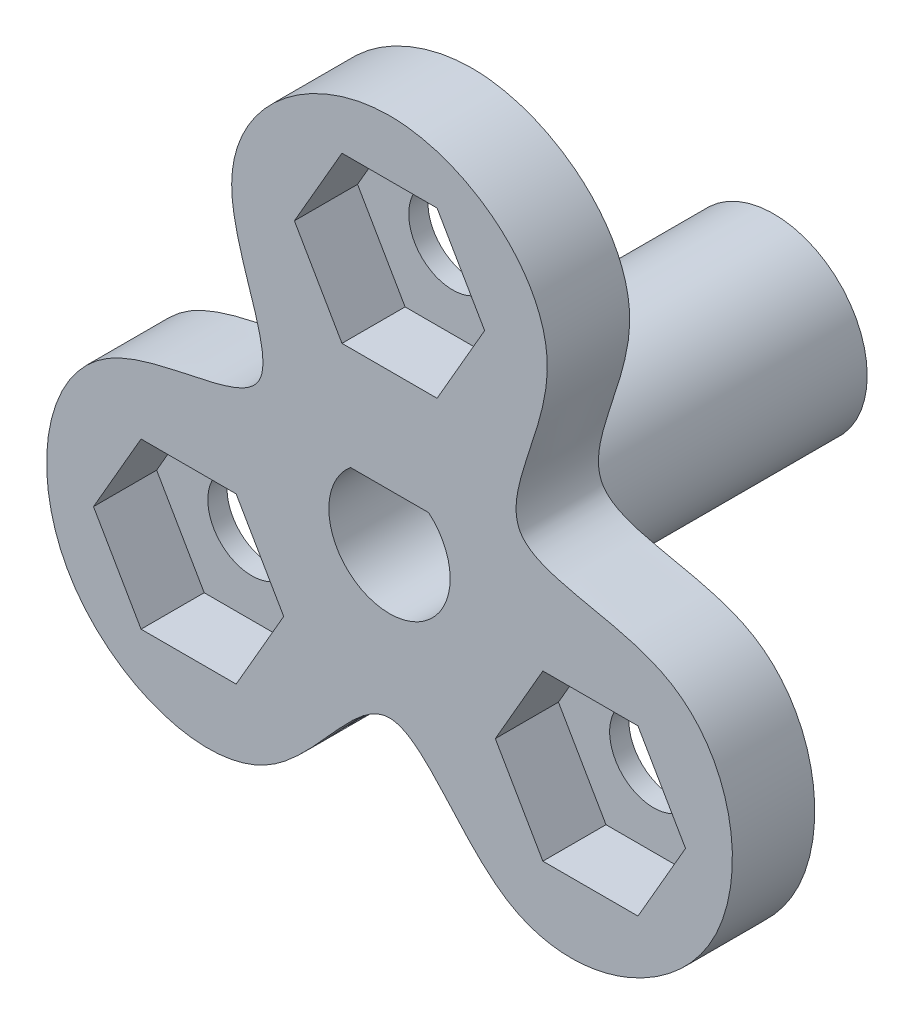
ISO-10303-21;
HEADER;
FILE_DESCRIPTION(('STEP AP214'),'2;1');
FILE_NAME('part.step','',(''),(''),'','','');
FILE_SCHEMA(('AUTOMOTIVE_DESIGN { 1 0 10303 214 1 1 1 1 }'));
ENDSEC;
DATA;
#1=APPLICATION_CONTEXT('core data for automotive mechanical design processes');
#2=APPLICATION_PROTOCOL_DEFINITION('international standard','automotive_design',2000,#1);
#3=PRODUCT_CONTEXT('',#1,'mechanical');
#4=PRODUCT('Part','Part','',(#3));
#5=PRODUCT_RELATED_PRODUCT_CATEGORY('part','',(#4));
#6=PRODUCT_DEFINITION_FORMATION('','',#4);
#7=PRODUCT_DEFINITION_CONTEXT('part definition',#1,'design');
#8=PRODUCT_DEFINITION('design','',#6,#7);
#9=PRODUCT_DEFINITION_SHAPE('','',#8);
#10=(LENGTH_UNIT() NAMED_UNIT(*) SI_UNIT(.MILLI.,.METRE.));
#11=(NAMED_UNIT(*) PLANE_ANGLE_UNIT() SI_UNIT($,.RADIAN.));
#12=(NAMED_UNIT(*) SI_UNIT($,.STERADIAN.) SOLID_ANGLE_UNIT());
#13=UNCERTAINTY_MEASURE_WITH_UNIT(LENGTH_MEASURE(1.E-05),#10,'distance_accuracy_value','');
#14=(GEOMETRIC_REPRESENTATION_CONTEXT(3) GLOBAL_UNCERTAINTY_ASSIGNED_CONTEXT((#13)) GLOBAL_UNIT_ASSIGNED_CONTEXT((#10,
#11,#12)) REPRESENTATION_CONTEXT('',''));
#15=CARTESIAN_POINT('',(0.,0.,0.));
#16=DIRECTION('',(0.,0.,1.));
#17=DIRECTION('',(1.,0.,0.));
#18=AXIS2_PLACEMENT_3D('',#15,#16,#17);
#19=CARTESIAN_POINT('',(-7.3179146619785,-4.225,0.7));
#20=DIRECTION('',(0.,0.,-1.));
#21=DIRECTION('',(-1.,0.,0.));
#22=AXIS2_PLACEMENT_3D('',#19,#20,#21);
#23=CYLINDRICAL_SURFACE('',#22,1.6);
#24=CARTESIAN_POINT('',(-7.3179146619785,-4.225,0.7));
#25=DIRECTION('',(0.,0.,1.));
#26=DIRECTION('',(1.,0.,0.));
#27=AXIS2_PLACEMENT_3D('',#24,#25,#26);
#28=CIRCLE('',#27,1.6);
#29=CARTESIAN_POINT('',(-5.71791466197851,-4.225,0.7));
#30=VERTEX_POINT('',#29);
#31=EDGE_CURVE('E384',#30,#30,#28,.T.);
#32=ORIENTED_EDGE('',*,*,#31,.T.);
#33=EDGE_LOOP('',(#32));
#34=FACE_BOUND('',#33,.T.);
#35=CARTESIAN_POINT('',(-7.3179146619785,-4.225,0.));
#36=DIRECTION('',(0.,0.,1.));
#37=DIRECTION('',(1.,0.,0.));
#38=AXIS2_PLACEMENT_3D('',#35,#36,#37);
#39=CIRCLE('',#38,1.6);
#40=CARTESIAN_POINT('',(-5.71791466197851,-4.225,0.));
#41=VERTEX_POINT('',#40);
#42=EDGE_CURVE('E42',#41,#41,#39,.T.);
#43=ORIENTED_EDGE('',*,*,#42,.F.);
#44=EDGE_LOOP('',(#43));
#45=FACE_BOUND('',#44,.T.);
#46=ADVANCED_FACE('F39',(#34,#45),#23,.F.);
#47=CARTESIAN_POINT('',(0.,0.,0.7));
#48=DIRECTION('',(0.,0.,1.));
#49=DIRECTION('',(1.,0.,0.));
#50=AXIS2_PLACEMENT_3D('',#47,#48,#49);
#51=PLANE('',#50);
#52=ORIENTED_EDGE('',*,*,#31,.F.);
#53=EDGE_LOOP('',(#52));
#54=FACE_BOUND('',#53,.T.);
#55=DIRECTION('',(0.500000000000001,-0.866025403784438,0.));
#56=VECTOR('',#55,1.);
#57=CARTESIAN_POINT('',(-9.91599087333181,-5.72500000000001,0.7));
#58=LINE('',#57,#56);
#59=CARTESIAN_POINT('',(-10.7820162771163,-4.22500000000001,0.7));
#60=VERTEX_POINT('',#59);
#61=CARTESIAN_POINT('',(-9.04996546954738,-7.225,0.7));
#62=VERTEX_POINT('',#61);
#63=EDGE_CURVE('E387',#60,#62,#58,.T.);
#64=ORIENTED_EDGE('',*,*,#63,.T.);
#65=DIRECTION('',(1.,0.,0.));
#66=VECTOR('',#65,1.);
#67=CARTESIAN_POINT('',(0.,-7.225,0.7));
#68=LINE('',#67,#66);
#69=CARTESIAN_POINT('',(-5.58586385440963,-7.225,0.7));
#70=VERTEX_POINT('',#69);
#71=EDGE_CURVE('E62',#62,#70,#68,.T.);
#72=ORIENTED_EDGE('',*,*,#71,.T.);
#73=DIRECTION('',(0.5,0.866025403784439,0.));
#74=VECTOR('',#73,1.);
#75=CARTESIAN_POINT('',(-1.06088111963594,0.6125,0.7));
#76=LINE('',#75,#74);
#77=CARTESIAN_POINT('',(-3.85381304684075,-4.225,0.7));
#78=VERTEX_POINT('',#77);
#79=EDGE_CURVE('E407',#70,#78,#76,.T.);
#80=ORIENTED_EDGE('',*,*,#79,.T.);
#81=DIRECTION('',(-0.500000000000001,0.866025403784438,0.));
#82=VECTOR('',#81,1.);
#83=CARTESIAN_POINT('',(-4.71983845062519,-2.725,0.7));
#84=LINE('',#83,#82);
#85=CARTESIAN_POINT('',(-5.58586385440963,-1.225,0.7));
#86=VERTEX_POINT('',#85);
#87=EDGE_CURVE('E410',#78,#86,#84,.T.);
#88=ORIENTED_EDGE('',*,*,#87,.T.);
#89=DIRECTION('',(-1.,0.,0.));
#90=VECTOR('',#89,1.);
#91=CARTESIAN_POINT('',(0.,-1.225,0.7));
#92=LINE('',#91,#90);
#93=CARTESIAN_POINT('',(-9.04996546954738,-1.22500000000001,0.7));
#94=VERTEX_POINT('',#93);
#95=EDGE_CURVE('E47',#86,#94,#92,.T.);
#96=ORIENTED_EDGE('',*,*,#95,.T.);
#97=DIRECTION('',(-0.499999999999999,-0.866025403784439,0.));
#98=VECTOR('',#97,1.);
#99=CARTESIAN_POINT('',(-6.25703354234258,3.61249999999999,0.7));
#100=LINE('',#99,#98);
#101=EDGE_CURVE('E11',#94,#60,#100,.T.);
#102=ORIENTED_EDGE('',*,*,#101,.T.);
#103=EDGE_LOOP('',(#64,#72,#80,#88,#96,#102));
#104=FACE_BOUND('',#103,.T.);
#105=ADVANCED_FACE('F368',(#54,#104),#51,.T.);
#106=CARTESIAN_POINT('',(0.,0.,0.));
#107=DIRECTION('',(0.,0.,1.));
#108=DIRECTION('',(1.,0.,0.));
#109=AXIS2_PLACEMENT_3D('',#106,#107,#108);
#110=PLANE('',#109);
#111=ORIENTED_EDGE('',*,*,#42,.T.);
#112=EDGE_LOOP('',(#111));
#113=FACE_BOUND('',#112,.T.);
#114=CARTESIAN_POINT('',(0.,8.45,0.));
#115=DIRECTION('',(0.,0.,1.));
#116=DIRECTION('',(1.,0.,0.));
#117=AXIS2_PLACEMENT_3D('',#114,#115,#116);
#118=CIRCLE('',#117,1.6);
#119=CARTESIAN_POINT('',(1.6,8.45,0.));
#120=VERTEX_POINT('',#119);
#121=EDGE_CURVE('E399',#120,#120,#118,.T.);
#122=ORIENTED_EDGE('',*,*,#121,.T.);
#123=EDGE_LOOP('',(#122));
#124=FACE_BOUND('',#123,.T.);
#125=CARTESIAN_POINT('',(7.31791466197851,-4.225,0.));
#126=DIRECTION('',(0.,0.,1.));
#127=DIRECTION('',(1.,0.,0.));
#128=AXIS2_PLACEMENT_3D('',#125,#126,#127);
#129=CIRCLE('',#128,1.6);
#130=CARTESIAN_POINT('',(8.91791466197851,-4.225,0.));
#131=VERTEX_POINT('',#130);
#132=EDGE_CURVE('E431',#131,#131,#129,.T.);
#133=ORIENTED_EDGE('',*,*,#132,.T.);
#134=EDGE_LOOP('',(#133));
#135=FACE_BOUND('',#134,.T.);
#136=CARTESIAN_POINT('',(0.,0.,0.));
#137=DIRECTION('',(0.,0.,1.));
#138=DIRECTION('',(1.,0.,0.));
#139=AXIS2_PLACEMENT_3D('',#136,#137,#138);
#140=CIRCLE('',#139,3.4);
#141=CARTESIAN_POINT('',(3.4,0.,0.));
#142=VERTEX_POINT('',#141);
#143=EDGE_CURVE('E203',#142,#142,#140,.T.);
#144=ORIENTED_EDGE('',*,*,#143,.T.);
#145=EDGE_LOOP('',(#144));
#146=FACE_BOUND('',#145,.T.);
#147=CARTESIAN_POINT('',(0.,13.5,0.));
#148=CARTESIAN_POINT('',(-2.87331985999361,13.5,0.));
#149=CARTESIAN_POINT('',(-7.91873378007043,9.56576436059761,0.));
#150=CARTESIAN_POINT('',(-2.47369152937391,1.42818647037611,0.));
#151=CARTESIAN_POINT('',(-12.2435618329286,2.07494243904816,0.));
#152=CARTESIAN_POINT('',(-13.6316844558638,-7.870256690101,0.));
#153=CARTESIAN_POINT('',(-4.32482805285811,-11.6407067996458,0.));
#154=CARTESIAN_POINT('',(0.,-2.85637294075223,0.));
#155=CARTESIAN_POINT('',(4.32482805285813,-11.6407067996458,0.));
#156=CARTESIAN_POINT('',(13.6316844558638,-7.870256690101,0.));
#157=CARTESIAN_POINT('',(12.2435618329286,2.07494243904817,0.));
#158=CARTESIAN_POINT('',(2.47369152937389,1.42818647037613,0.));
#159=CARTESIAN_POINT('',(7.91873378007044,9.56576436059761,0.));
#160=CARTESIAN_POINT('',(2.87331985999361,13.5,0.));
#161=CARTESIAN_POINT('',(0.,13.5,0.));
#162=B_SPLINE_CURVE_WITH_KNOTS('',3,(#147,#148,#149,#150,#151,#152,#153,#154,#155,#156,#157,
#158,#159,#160,#161),.UNSPECIFIED.,.T.,.F.,(4,1,1,1,1,1,1,1,1,1,1,1,4),(0.,0.0949152340953971,
0.166666666666667,0.238418099237936,0.333333333333333,0.428248567428731,0.5,0.57175143257127,
0.666666666666667,0.761581900762064,0.833333333333333,0.905084765904603,1.),.UNSPECIFIED.);
#163=CARTESIAN_POINT('',(0.,13.5,0.));
#164=VERTEX_POINT('',#163);
#165=EDGE_CURVE('E207',#164,#164,#162,.T.);
#166=ORIENTED_EDGE('',*,*,#165,.F.);
#167=EDGE_LOOP('',(#166));
#168=FACE_BOUND('',#167,.T.);
#169=ADVANCED_FACE('F302',(#113,#124,#135,#146,#168),#110,.F.);
#170=CARTESIAN_POINT('',(-9.91599087333181,-5.72500000000001,3.));
#171=DIRECTION('',(0.866025403784438,0.500000000000001,0.));
#172=DIRECTION('',(-0.500000000000001,0.866025403784438,0.));
#173=AXIS2_PLACEMENT_3D('',#170,#171,#172);
#174=PLANE('',#173);
#175=ORIENTED_EDGE('',*,*,#63,.F.);
#176=DIRECTION('',(0.,0.,-1.));
#177=VECTOR('',#176,1.);
#178=CARTESIAN_POINT('',(-10.7820162771163,-4.22500000000001,3.));
#179=LINE('',#178,#177);
#180=CARTESIAN_POINT('',(-10.7820162771163,-4.22500000000001,3.));
#181=VERTEX_POINT('',#180);
#182=EDGE_CURVE('E54',#181,#60,#179,.T.);
#183=ORIENTED_EDGE('',*,*,#182,.F.);
#184=DIRECTION('',(0.500000000000001,-0.866025403784438,0.));
#185=VECTOR('',#184,1.);
#186=CARTESIAN_POINT('',(-9.91599087333181,-5.72500000000001,3.));
#187=LINE('',#186,#185);
#188=CARTESIAN_POINT('',(-9.04996546954738,-7.225,3.));
#189=VERTEX_POINT('',#188);
#190=EDGE_CURVE('E247',#181,#189,#187,.T.);
#191=ORIENTED_EDGE('',*,*,#190,.T.);
#192=DIRECTION('',(0.,0.,-1.));
#193=VECTOR('',#192,1.);
#194=CARTESIAN_POINT('',(-9.04996546954738,-7.225,3.));
#195=LINE('',#194,#193);
#196=EDGE_CURVE('E429',#189,#62,#195,.T.);
#197=ORIENTED_EDGE('',*,*,#196,.T.);
#198=EDGE_LOOP('',(#175,#183,#191,#197));
#199=FACE_BOUND('',#198,.T.);
#200=ADVANCED_FACE('F299',(#199),#174,.T.);
#201=CARTESIAN_POINT('',(0.,-7.225,3.));
#202=DIRECTION('',(0.,1.,0.));
#203=DIRECTION('',(-1.,0.,0.));
#204=AXIS2_PLACEMENT_3D('',#201,#202,#203);
#205=PLANE('',#204);
#206=ORIENTED_EDGE('',*,*,#71,.F.);
#207=ORIENTED_EDGE('',*,*,#196,.F.);
#208=DIRECTION('',(1.,0.,0.));
#209=VECTOR('',#208,1.);
#210=CARTESIAN_POINT('',(0.,-7.225,3.));
#211=LINE('',#210,#209);
#212=CARTESIAN_POINT('',(-5.58586385440963,-7.225,3.));
#213=VERTEX_POINT('',#212);
#214=EDGE_CURVE('E244',#189,#213,#211,.T.);
#215=ORIENTED_EDGE('',*,*,#214,.T.);
#216=DIRECTION('',(0.,0.,-1.));
#217=VECTOR('',#216,1.);
#218=CARTESIAN_POINT('',(-5.58586385440963,-7.225,3.));
#219=LINE('',#218,#217);
#220=EDGE_CURVE('E425',#213,#70,#219,.T.);
#221=ORIENTED_EDGE('',*,*,#220,.T.);
#222=EDGE_LOOP('',(#206,#207,#215,#221));
#223=FACE_BOUND('',#222,.T.);
#224=ADVANCED_FACE('F286',(#223),#205,.T.);
#225=CARTESIAN_POINT('',(-1.06088111963594,0.6125,3.));
#226=DIRECTION('',(-0.866025403784439,0.5,0.));
#227=DIRECTION('',(-0.5,-0.866025403784439,0.));
#228=AXIS2_PLACEMENT_3D('',#225,#226,#227);
#229=PLANE('',#228);
#230=ORIENTED_EDGE('',*,*,#79,.F.);
#231=ORIENTED_EDGE('',*,*,#220,.F.);
#232=DIRECTION('',(0.5,0.866025403784439,0.));
#233=VECTOR('',#232,1.);
#234=CARTESIAN_POINT('',(-1.06088111963594,0.6125,3.));
#235=LINE('',#234,#233);
#236=CARTESIAN_POINT('',(-3.85381304684075,-4.225,3.));
#237=VERTEX_POINT('',#236);
#238=EDGE_CURVE('E258',#213,#237,#235,.T.);
#239=ORIENTED_EDGE('',*,*,#238,.T.);
#240=DIRECTION('',(0.,0.,-1.));
#241=VECTOR('',#240,1.);
#242=CARTESIAN_POINT('',(-3.85381304684075,-4.225,3.));
#243=LINE('',#242,#241);
#244=EDGE_CURVE('E422',#237,#78,#243,.T.);
#245=ORIENTED_EDGE('',*,*,#244,.T.);
#246=EDGE_LOOP('',(#230,#231,#239,#245));
#247=FACE_BOUND('',#246,.T.);
#248=ADVANCED_FACE('F282',(#247),#229,.T.);
#249=CARTESIAN_POINT('',(-4.71983845062519,-2.725,3.));
#250=DIRECTION('',(-0.866025403784438,-0.500000000000001,0.));
#251=DIRECTION('',(0.500000000000001,-0.866025403784438,0.));
#252=AXIS2_PLACEMENT_3D('',#249,#250,#251);
#253=PLANE('',#252);
#254=ORIENTED_EDGE('',*,*,#87,.F.);
#255=ORIENTED_EDGE('',*,*,#244,.F.);
#256=DIRECTION('',(-0.500000000000001,0.866025403784438,0.));
#257=VECTOR('',#256,1.);
#258=CARTESIAN_POINT('',(-4.71983845062519,-2.725,3.));
#259=LINE('',#258,#257);
#260=CARTESIAN_POINT('',(-5.58586385440963,-1.225,3.));
#261=VERTEX_POINT('',#260);
#262=EDGE_CURVE('E255',#237,#261,#259,.T.);
#263=ORIENTED_EDGE('',*,*,#262,.T.);
#264=DIRECTION('',(0.,0.,-1.));
#265=VECTOR('',#264,1.);
#266=CARTESIAN_POINT('',(-5.58586385440963,-1.225,3.));
#267=LINE('',#266,#265);
#268=EDGE_CURVE('E417',#261,#86,#267,.T.);
#269=ORIENTED_EDGE('',*,*,#268,.T.);
#270=EDGE_LOOP('',(#254,#255,#263,#269));
#271=FACE_BOUND('',#270,.T.);
#272=ADVANCED_FACE('F285',(#271),#253,.T.);
#273=CARTESIAN_POINT('',(0.,-1.225,3.));
#274=DIRECTION('',(0.,-1.,0.));
#275=DIRECTION('',(1.,0.,0.));
#276=AXIS2_PLACEMENT_3D('',#273,#274,#275);
#277=PLANE('',#276);
#278=ORIENTED_EDGE('',*,*,#95,.F.);
#279=ORIENTED_EDGE('',*,*,#268,.F.);
#280=DIRECTION('',(-1.,0.,0.));
#281=VECTOR('',#280,1.);
#282=CARTESIAN_POINT('',(0.,-1.225,3.));
#283=LINE('',#282,#281);
#284=CARTESIAN_POINT('',(-9.04996546954738,-1.22500000000001,3.));
#285=VERTEX_POINT('',#284);
#286=EDGE_CURVE('E252',#261,#285,#283,.T.);
#287=ORIENTED_EDGE('',*,*,#286,.T.);
#288=DIRECTION('',(0.,0.,-1.));
#289=VECTOR('',#288,1.);
#290=CARTESIAN_POINT('',(-9.04996546954738,-1.22500000000001,3.));
#291=LINE('',#290,#289);
#292=EDGE_CURVE('E419',#285,#94,#291,.T.);
#293=ORIENTED_EDGE('',*,*,#292,.T.);
#294=EDGE_LOOP('',(#278,#279,#287,#293));
#295=FACE_BOUND('',#294,.T.);
#296=ADVANCED_FACE('F290',(#295),#277,.T.);
#297=CARTESIAN_POINT('',(-6.25703354234258,3.61249999999999,3.));
#298=DIRECTION('',(0.866025403784439,-0.499999999999999,0.));
#299=DIRECTION('',(0.499999999999999,0.866025403784439,0.));
#300=AXIS2_PLACEMENT_3D('',#297,#298,#299);
#301=PLANE('',#300);
#302=ORIENTED_EDGE('',*,*,#101,.F.);
#303=ORIENTED_EDGE('',*,*,#292,.F.);
#304=DIRECTION('',(-0.499999999999999,-0.866025403784439,0.));
#305=VECTOR('',#304,1.);
#306=CARTESIAN_POINT('',(-6.25703354234258,3.61249999999999,3.));
#307=LINE('',#306,#305);
#308=EDGE_CURVE('E250',#285,#181,#307,.T.);
#309=ORIENTED_EDGE('',*,*,#308,.T.);
#310=ORIENTED_EDGE('',*,*,#182,.T.);
#311=EDGE_LOOP('',(#302,#303,#309,#310));
#312=FACE_BOUND('',#311,.T.);
#313=ADVANCED_FACE('F294',(#312),#301,.T.);
#314=CARTESIAN_POINT('',(0.,8.45,0.7));
#315=DIRECTION('',(0.,0.,-1.));
#316=DIRECTION('',(-1.,0.,0.));
#317=AXIS2_PLACEMENT_3D('',#314,#315,#316);
#318=CYLINDRICAL_SURFACE('',#317,1.6);
#319=CARTESIAN_POINT('',(0.,8.45,0.7));
#320=DIRECTION('',(0.,0.,1.));
#321=DIRECTION('',(1.,0.,0.));
#322=AXIS2_PLACEMENT_3D('',#319,#320,#321);
#323=CIRCLE('',#322,1.6);
#324=CARTESIAN_POINT('',(1.6,8.45,0.7));
#325=VERTEX_POINT('',#324);
#326=EDGE_CURVE('E401',#325,#325,#323,.T.);
#327=ORIENTED_EDGE('',*,*,#326,.T.);
#328=EDGE_LOOP('',(#327));
#329=FACE_BOUND('',#328,.T.);
#330=ORIENTED_EDGE('',*,*,#121,.F.);
#331=EDGE_LOOP('',(#330));
#332=FACE_BOUND('',#331,.T.);
#333=ADVANCED_FACE('F298',(#329,#332),#318,.F.);
#334=CARTESIAN_POINT('',(0.,0.,0.7));
#335=DIRECTION('',(0.,0.,1.));
#336=DIRECTION('',(1.,0.,0.));
#337=AXIS2_PLACEMENT_3D('',#334,#335,#336);
#338=PLANE('',#337);
#339=ORIENTED_EDGE('',*,*,#326,.F.);
#340=EDGE_LOOP('',(#339));
#341=FACE_BOUND('',#340,.T.);
#342=DIRECTION('',(-1.,0.,0.));
#343=VECTOR('',#342,1.);
#344=CARTESIAN_POINT('',(0.,11.45,0.7));
#345=LINE('',#344,#343);
#346=CARTESIAN_POINT('',(1.73205080756887,11.45,0.7));
#347=VERTEX_POINT('',#346);
#348=CARTESIAN_POINT('',(-1.73205080756888,11.45,0.7));
#349=VERTEX_POINT('',#348);
#350=EDGE_CURVE('E489',#347,#349,#345,.T.);
#351=ORIENTED_EDGE('',*,*,#350,.T.);
#352=DIRECTION('',(-0.5,-0.866025403784439,0.));
#353=VECTOR('',#352,1.);
#354=CARTESIAN_POINT('',(-6.25703354234257,3.61249999999999,0.7));
#355=LINE('',#354,#353);
#356=CARTESIAN_POINT('',(-3.46410161513775,8.45,0.7));
#357=VERTEX_POINT('',#356);
#358=EDGE_CURVE('E491',#349,#357,#355,.T.);
#359=ORIENTED_EDGE('',*,*,#358,.T.);
#360=DIRECTION('',(0.5,-0.866025403784439,0.));
#361=VECTOR('',#360,1.);
#362=CARTESIAN_POINT('',(1.06088111963594,0.612500000000001,0.7));
#363=LINE('',#362,#361);
#364=CARTESIAN_POINT('',(-1.73205080756887,5.45,0.7));
#365=VERTEX_POINT('',#364);
#366=EDGE_CURVE('E494',#357,#365,#363,.T.);
#367=ORIENTED_EDGE('',*,*,#366,.T.);
#368=DIRECTION('',(1.,0.,0.));
#369=VECTOR('',#368,1.);
#370=CARTESIAN_POINT('',(0.,5.45,0.7));
#371=LINE('',#370,#369);
#372=CARTESIAN_POINT('',(1.73205080756888,5.45,0.7));
#373=VERTEX_POINT('',#372);
#374=EDGE_CURVE('E395',#365,#373,#371,.T.);
#375=ORIENTED_EDGE('',*,*,#374,.T.);
#376=DIRECTION('',(0.499999999999999,0.866025403784439,0.));
#377=VECTOR('',#376,1.);
#378=CARTESIAN_POINT('',(-1.06088111963593,0.612499999999997,0.7));
#379=LINE('',#378,#377);
#380=CARTESIAN_POINT('',(3.46410161513775,8.45,0.7));
#381=VERTEX_POINT('',#380);
#382=EDGE_CURVE('E390',#373,#381,#379,.T.);
#383=ORIENTED_EDGE('',*,*,#382,.T.);
#384=DIRECTION('',(-0.5,0.866025403784438,0.));
#385=VECTOR('',#384,1.);
#386=CARTESIAN_POINT('',(6.25703354234257,3.6125,0.7));
#387=LINE('',#386,#385);
#388=EDGE_CURVE('E386',#381,#347,#387,.T.);
#389=ORIENTED_EDGE('',*,*,#388,.T.);
#390=EDGE_LOOP('',(#351,#359,#367,#375,#383,#389));
#391=FACE_BOUND('',#390,.T.);
#392=ADVANCED_FACE('F351',(#341,#391),#338,.T.);
#393=CARTESIAN_POINT('',(0.,11.45,3.));
#394=DIRECTION('',(0.,-1.,0.));
#395=DIRECTION('',(1.,0.,0.));
#396=AXIS2_PLACEMENT_3D('',#393,#394,#395);
#397=PLANE('',#396);
#398=ORIENTED_EDGE('',*,*,#350,.F.);
#399=DIRECTION('',(0.,0.,-1.));
#400=VECTOR('',#399,1.);
#401=CARTESIAN_POINT('',(1.73205080756887,11.45,3.));
#402=LINE('',#401,#400);
#403=CARTESIAN_POINT('',(1.73205080756887,11.45,3.));
#404=VERTEX_POINT('',#403);
#405=EDGE_CURVE('E461',#404,#347,#402,.T.);
#406=ORIENTED_EDGE('',*,*,#405,.F.);
#407=DIRECTION('',(-1.,0.,0.));
#408=VECTOR('',#407,1.);
#409=CARTESIAN_POINT('',(0.,11.45,3.));
#410=LINE('',#409,#408);
#411=CARTESIAN_POINT('',(-1.73205080756888,11.45,3.));
#412=VERTEX_POINT('',#411);
#413=EDGE_CURVE('E211',#404,#412,#410,.T.);
#414=ORIENTED_EDGE('',*,*,#413,.T.);
#415=DIRECTION('',(0.,0.,-1.));
#416=VECTOR('',#415,1.);
#417=CARTESIAN_POINT('',(-1.73205080756888,11.45,3.));
#418=LINE('',#417,#416);
#419=EDGE_CURVE('E436',#412,#349,#418,.T.);
#420=ORIENTED_EDGE('',*,*,#419,.T.);
#421=EDGE_LOOP('',(#398,#406,#414,#420));
#422=FACE_BOUND('',#421,.T.);
#423=ADVANCED_FACE('F348',(#422),#397,.T.);
#424=CARTESIAN_POINT('',(-6.25703354234257,3.61249999999999,3.));
#425=DIRECTION('',(0.866025403784439,-0.5,0.));
#426=DIRECTION('',(0.5,0.866025403784439,0.));
#427=AXIS2_PLACEMENT_3D('',#424,#425,#426);
#428=PLANE('',#427);
#429=ORIENTED_EDGE('',*,*,#358,.F.);
#430=ORIENTED_EDGE('',*,*,#419,.F.);
#431=DIRECTION('',(-0.5,-0.866025403784439,0.));
#432=VECTOR('',#431,1.);
#433=CARTESIAN_POINT('',(-6.25703354234257,3.61249999999999,3.));
#434=LINE('',#433,#432);
#435=CARTESIAN_POINT('',(-3.46410161513775,8.45,3.));
#436=VERTEX_POINT('',#435);
#437=EDGE_CURVE('E208',#412,#436,#434,.T.);
#438=ORIENTED_EDGE('',*,*,#437,.T.);
#439=DIRECTION('',(0.,0.,-1.));
#440=VECTOR('',#439,1.);
#441=CARTESIAN_POINT('',(-3.46410161513775,8.45,3.));
#442=LINE('',#441,#440);
#443=EDGE_CURVE('E267',#436,#357,#442,.T.);
#444=ORIENTED_EDGE('',*,*,#443,.T.);
#445=EDGE_LOOP('',(#429,#430,#438,#444));
#446=FACE_BOUND('',#445,.T.);
#447=ADVANCED_FACE('F334',(#446),#428,.T.);
#448=CARTESIAN_POINT('',(1.06088111963594,0.612500000000001,3.));
#449=DIRECTION('',(0.866025403784439,0.5,0.));
#450=DIRECTION('',(-0.5,0.866025403784439,0.));
#451=AXIS2_PLACEMENT_3D('',#448,#449,#450);
#452=PLANE('',#451);
#453=ORIENTED_EDGE('',*,*,#366,.F.);
#454=ORIENTED_EDGE('',*,*,#443,.F.);
#455=DIRECTION('',(0.5,-0.866025403784439,0.));
#456=VECTOR('',#455,1.);
#457=CARTESIAN_POINT('',(1.06088111963594,0.612500000000001,3.));
#458=LINE('',#457,#456);
#459=CARTESIAN_POINT('',(-1.73205080756887,5.45,3.));
#460=VERTEX_POINT('',#459);
#461=EDGE_CURVE('E223',#436,#460,#458,.T.);
#462=ORIENTED_EDGE('',*,*,#461,.T.);
#463=DIRECTION('',(0.,0.,-1.));
#464=VECTOR('',#463,1.);
#465=CARTESIAN_POINT('',(-1.73205080756887,5.45,3.));
#466=LINE('',#465,#464);
#467=EDGE_CURVE('E452',#460,#365,#466,.T.);
#468=ORIENTED_EDGE('',*,*,#467,.T.);
#469=EDGE_LOOP('',(#453,#454,#462,#468));
#470=FACE_BOUND('',#469,.T.);
#471=ADVANCED_FACE('F330',(#470),#452,.T.);
#472=CARTESIAN_POINT('',(0.,5.45,3.));
#473=DIRECTION('',(0.,1.,0.));
#474=DIRECTION('',(0.,0.,1.));
#475=AXIS2_PLACEMENT_3D('',#472,#473,#474);
#476=PLANE('',#475);
#477=ORIENTED_EDGE('',*,*,#374,.F.);
#478=ORIENTED_EDGE('',*,*,#467,.F.);
#479=DIRECTION('',(1.,0.,0.));
#480=VECTOR('',#479,1.);
#481=CARTESIAN_POINT('',(0.,5.45,3.));
#482=LINE('',#481,#480);
#483=CARTESIAN_POINT('',(1.73205080756888,5.45,3.));
#484=VERTEX_POINT('',#483);
#485=EDGE_CURVE('E220',#460,#484,#482,.T.);
#486=ORIENTED_EDGE('',*,*,#485,.T.);
#487=DIRECTION('',(0.,0.,-1.));
#488=VECTOR('',#487,1.);
#489=CARTESIAN_POINT('',(1.73205080756888,5.45,3.));
#490=LINE('',#489,#488);
#491=EDGE_CURVE('E455',#484,#373,#490,.T.);
#492=ORIENTED_EDGE('',*,*,#491,.T.);
#493=EDGE_LOOP('',(#477,#478,#486,#492));
#494=FACE_BOUND('',#493,.T.);
#495=ADVANCED_FACE('F333',(#494),#476,.T.);
#496=CARTESIAN_POINT('',(-1.06088111963593,0.612499999999997,3.));
#497=DIRECTION('',(-0.866025403784439,0.499999999999999,0.));
#498=DIRECTION('',(-0.499999999999999,-0.866025403784439,0.));
#499=AXIS2_PLACEMENT_3D('',#496,#497,#498);
#500=PLANE('',#499);
#501=ORIENTED_EDGE('',*,*,#382,.F.);
#502=ORIENTED_EDGE('',*,*,#491,.F.);
#503=DIRECTION('',(0.499999999999999,0.866025403784439,0.));
#504=VECTOR('',#503,1.);
#505=CARTESIAN_POINT('',(-1.06088111963593,0.612499999999997,3.));
#506=LINE('',#505,#504);
#507=CARTESIAN_POINT('',(3.46410161513775,8.45,3.));
#508=VERTEX_POINT('',#507);
#509=EDGE_CURVE('E217',#484,#508,#506,.T.);
#510=ORIENTED_EDGE('',*,*,#509,.T.);
#511=DIRECTION('',(0.,0.,-1.));
#512=VECTOR('',#511,1.);
#513=CARTESIAN_POINT('',(3.46410161513775,8.45,3.));
#514=LINE('',#513,#512);
#515=EDGE_CURVE('E458',#508,#381,#514,.T.);
#516=ORIENTED_EDGE('',*,*,#515,.T.);
#517=EDGE_LOOP('',(#501,#502,#510,#516));
#518=FACE_BOUND('',#517,.T.);
#519=ADVANCED_FACE('F338',(#518),#500,.T.);
#520=CARTESIAN_POINT('',(6.25703354234257,3.6125,3.));
#521=DIRECTION('',(-0.866025403784438,-0.5,0.));
#522=DIRECTION('',(0.5,-0.866025403784438,0.));
#523=AXIS2_PLACEMENT_3D('',#520,#521,#522);
#524=PLANE('',#523);
#525=ORIENTED_EDGE('',*,*,#388,.F.);
#526=ORIENTED_EDGE('',*,*,#515,.F.);
#527=DIRECTION('',(-0.5,0.866025403784438,0.));
#528=VECTOR('',#527,1.);
#529=CARTESIAN_POINT('',(6.25703354234257,3.6125,3.));
#530=LINE('',#529,#528);
#531=EDGE_CURVE('E214',#508,#404,#530,.T.);
#532=ORIENTED_EDGE('',*,*,#531,.T.);
#533=ORIENTED_EDGE('',*,*,#405,.T.);
#534=EDGE_LOOP('',(#525,#526,#532,#533));
#535=FACE_BOUND('',#534,.T.);
#536=ADVANCED_FACE('F342',(#535),#524,.T.);
#537=CARTESIAN_POINT('',(7.31791466197851,-4.225,0.7));
#538=DIRECTION('',(0.,0.,-1.));
#539=DIRECTION('',(-1.,0.,0.));
#540=AXIS2_PLACEMENT_3D('',#537,#538,#539);
#541=CYLINDRICAL_SURFACE('',#540,1.6);
#542=CARTESIAN_POINT('',(7.31791466197851,-4.225,0.7));
#543=DIRECTION('',(0.,0.,1.));
#544=DIRECTION('',(1.,0.,0.));
#545=AXIS2_PLACEMENT_3D('',#542,#543,#544);
#546=CIRCLE('',#545,1.6);
#547=CARTESIAN_POINT('',(8.91791466197851,-4.225,0.7));
#548=VERTEX_POINT('',#547);
#549=EDGE_CURVE('E465',#548,#548,#546,.T.);
#550=ORIENTED_EDGE('',*,*,#549,.T.);
#551=EDGE_LOOP('',(#550));
#552=FACE_BOUND('',#551,.T.);
#553=ORIENTED_EDGE('',*,*,#132,.F.);
#554=EDGE_LOOP('',(#553));
#555=FACE_BOUND('',#554,.T.);
#556=ADVANCED_FACE('F346',(#552,#555),#541,.F.);
#557=CARTESIAN_POINT('',(0.,0.,0.7));
#558=DIRECTION('',(0.,0.,1.));
#559=DIRECTION('',(1.,0.,0.));
#560=AXIS2_PLACEMENT_3D('',#557,#558,#559);
#561=PLANE('',#560);
#562=ORIENTED_EDGE('',*,*,#549,.F.);
#563=EDGE_LOOP('',(#562));
#564=FACE_BOUND('',#563,.T.);
#565=DIRECTION('',(0.499999999999999,0.866025403784439,0.));
#566=VECTOR('',#565,1.);
#567=CARTESIAN_POINT('',(9.91599087333183,-5.72499999999999,0.7));
#568=LINE('',#567,#566);
#569=CARTESIAN_POINT('',(9.04996546954739,-7.225,0.7));
#570=VERTEX_POINT('',#569);
#571=CARTESIAN_POINT('',(10.7820162771163,-4.225,0.7));
#572=VERTEX_POINT('',#571);
#573=EDGE_CURVE('E468',#570,#572,#568,.T.);
#574=ORIENTED_EDGE('',*,*,#573,.T.);
#575=DIRECTION('',(-0.5,0.866025403784439,0.));
#576=VECTOR('',#575,1.);
#577=CARTESIAN_POINT('',(6.25703354234257,3.6125,0.7));
#578=LINE('',#577,#576);
#579=CARTESIAN_POINT('',(9.04996546954738,-1.225,0.7));
#580=VERTEX_POINT('',#579);
#581=EDGE_CURVE('E471',#572,#580,#578,.T.);
#582=ORIENTED_EDGE('',*,*,#581,.T.);
#583=DIRECTION('',(-1.,0.,0.));
#584=VECTOR('',#583,1.);
#585=CARTESIAN_POINT('',(0.,-1.225,0.7));
#586=LINE('',#585,#584);
#587=CARTESIAN_POINT('',(5.58586385440963,-1.225,0.7));
#588=VERTEX_POINT('',#587);
#589=EDGE_CURVE('E474',#580,#588,#586,.T.);
#590=ORIENTED_EDGE('',*,*,#589,.T.);
#591=DIRECTION('',(-0.5,-0.866025403784439,0.));
#592=VECTOR('',#591,1.);
#593=CARTESIAN_POINT('',(4.71983845062519,-2.725,0.7));
#594=LINE('',#593,#592);
#595=CARTESIAN_POINT('',(3.85381304684075,-4.225,0.7));
#596=VERTEX_POINT('',#595);
#597=EDGE_CURVE('E477',#588,#596,#594,.T.);
#598=ORIENTED_EDGE('',*,*,#597,.T.);
#599=DIRECTION('',(0.500000000000001,-0.866025403784438,0.));
#600=VECTOR('',#599,1.);
#601=CARTESIAN_POINT('',(1.06088111963593,0.612499999999999,0.7));
#602=LINE('',#601,#600);
#603=CARTESIAN_POINT('',(5.58586385440963,-7.225,0.7));
#604=VERTEX_POINT('',#603);
#605=EDGE_CURVE('E480',#596,#604,#602,.T.);
#606=ORIENTED_EDGE('',*,*,#605,.T.);
#607=DIRECTION('',(1.,0.,0.));
#608=VECTOR('',#607,1.);
#609=CARTESIAN_POINT('',(0.,-7.225,0.7));
#610=LINE('',#609,#608);
#611=EDGE_CURVE('E402',#604,#570,#610,.T.);
#612=ORIENTED_EDGE('',*,*,#611,.T.);
#613=EDGE_LOOP('',(#574,#582,#590,#598,#606,#612));
#614=FACE_BOUND('',#613,.T.);
#615=ADVANCED_FACE('F325',(#564,#614),#561,.T.);
#616=CARTESIAN_POINT('',(9.91599087333183,-5.72499999999999,3.));
#617=DIRECTION('',(-0.866025403784439,0.499999999999999,0.));
#618=DIRECTION('',(-0.499999999999999,-0.866025403784439,0.));
#619=AXIS2_PLACEMENT_3D('',#616,#617,#618);
#620=PLANE('',#619);
#621=ORIENTED_EDGE('',*,*,#573,.F.);
#622=DIRECTION('',(0.,0.,-1.));
#623=VECTOR('',#622,1.);
#624=CARTESIAN_POINT('',(9.04996546954739,-7.225,3.));
#625=LINE('',#624,#623);
#626=CARTESIAN_POINT('',(9.04996546954739,-7.225,3.));
#627=VERTEX_POINT('',#626);
#628=EDGE_CURVE('E445',#627,#570,#625,.T.);
#629=ORIENTED_EDGE('',*,*,#628,.F.);
#630=DIRECTION('',(0.499999999999999,0.866025403784439,0.));
#631=VECTOR('',#630,1.);
#632=CARTESIAN_POINT('',(9.91599087333183,-5.72499999999999,3.));
#633=LINE('',#632,#631);
#634=CARTESIAN_POINT('',(10.7820162771163,-4.225,3.));
#635=VERTEX_POINT('',#634);
#636=EDGE_CURVE('E229',#627,#635,#633,.T.);
#637=ORIENTED_EDGE('',*,*,#636,.T.);
#638=DIRECTION('',(0.,0.,-1.));
#639=VECTOR('',#638,1.);
#640=CARTESIAN_POINT('',(10.7820162771163,-4.225,3.));
#641=LINE('',#640,#639);
#642=EDGE_CURVE('E447',#635,#572,#641,.T.);
#643=ORIENTED_EDGE('',*,*,#642,.T.);
#644=EDGE_LOOP('',(#621,#629,#637,#643));
#645=FACE_BOUND('',#644,.T.);
#646=ADVANCED_FACE('F322',(#645),#620,.T.);
#647=CARTESIAN_POINT('',(6.25703354234257,3.6125,3.));
#648=DIRECTION('',(-0.866025403784439,-0.5,0.));
#649=DIRECTION('',(0.5,-0.866025403784439,0.));
#650=AXIS2_PLACEMENT_3D('',#647,#648,#649);
#651=PLANE('',#650);
#652=ORIENTED_EDGE('',*,*,#581,.F.);
#653=ORIENTED_EDGE('',*,*,#642,.F.);
#654=DIRECTION('',(-0.5,0.866025403784439,0.));
#655=VECTOR('',#654,1.);
#656=CARTESIAN_POINT('',(6.25703354234257,3.6125,3.));
#657=LINE('',#656,#655);
#658=CARTESIAN_POINT('',(9.04996546954738,-1.225,3.));
#659=VERTEX_POINT('',#658);
#660=EDGE_CURVE('E226',#635,#659,#657,.T.);
#661=ORIENTED_EDGE('',*,*,#660,.T.);
#662=DIRECTION('',(0.,0.,-1.));
#663=VECTOR('',#662,1.);
#664=CARTESIAN_POINT('',(9.04996546954738,-1.225,3.));
#665=LINE('',#664,#663);
#666=EDGE_CURVE('E432',#659,#580,#665,.T.);
#667=ORIENTED_EDGE('',*,*,#666,.T.);
#668=EDGE_LOOP('',(#652,#653,#661,#667));
#669=FACE_BOUND('',#668,.T.);
#670=ADVANCED_FACE('F310',(#669),#651,.T.);
#671=CARTESIAN_POINT('',(0.,-1.225,3.));
#672=DIRECTION('',(0.,-1.,0.));
#673=DIRECTION('',(1.,0.,0.));
#674=AXIS2_PLACEMENT_3D('',#671,#672,#673);
#675=PLANE('',#674);
#676=ORIENTED_EDGE('',*,*,#589,.F.);
#677=ORIENTED_EDGE('',*,*,#666,.F.);
#678=DIRECTION('',(-1.,0.,0.));
#679=VECTOR('',#678,1.);
#680=CARTESIAN_POINT('',(0.,-1.225,3.));
#681=LINE('',#680,#679);
#682=CARTESIAN_POINT('',(5.58586385440963,-1.225,3.));
#683=VERTEX_POINT('',#682);
#684=EDGE_CURVE('E241',#659,#683,#681,.T.);
#685=ORIENTED_EDGE('',*,*,#684,.T.);
#686=DIRECTION('',(0.,0.,-1.));
#687=VECTOR('',#686,1.);
#688=CARTESIAN_POINT('',(5.58586385440963,-1.225,3.));
#689=LINE('',#688,#687);
#690=EDGE_CURVE('E435',#683,#588,#689,.T.);
#691=ORIENTED_EDGE('',*,*,#690,.T.);
#692=EDGE_LOOP('',(#676,#677,#685,#691));
#693=FACE_BOUND('',#692,.T.);
#694=ADVANCED_FACE('F306',(#693),#675,.T.);
#695=CARTESIAN_POINT('',(4.71983845062519,-2.725,3.));
#696=DIRECTION('',(0.866025403784439,-0.499999999999999,0.));
#697=DIRECTION('',(0.499999999999999,0.866025403784439,0.));
#698=AXIS2_PLACEMENT_3D('',#695,#696,#697);
#699=PLANE('',#698);
#700=ORIENTED_EDGE('',*,*,#597,.F.);
#701=ORIENTED_EDGE('',*,*,#690,.F.);
#702=DIRECTION('',(-0.5,-0.866025403784439,0.));
#703=VECTOR('',#702,1.);
#704=CARTESIAN_POINT('',(4.71983845062519,-2.725,3.));
#705=LINE('',#704,#703);
#706=CARTESIAN_POINT('',(3.85381304684075,-4.225,3.));
#707=VERTEX_POINT('',#706);
#708=EDGE_CURVE('E238',#683,#707,#705,.T.);
#709=ORIENTED_EDGE('',*,*,#708,.T.);
#710=DIRECTION('',(0.,0.,-1.));
#711=VECTOR('',#710,1.);
#712=CARTESIAN_POINT('',(3.85381304684075,-4.225,3.));
#713=LINE('',#712,#711);
#714=EDGE_CURVE('E439',#707,#596,#713,.T.);
#715=ORIENTED_EDGE('',*,*,#714,.T.);
#716=EDGE_LOOP('',(#700,#701,#709,#715));
#717=FACE_BOUND('',#716,.T.);
#718=ADVANCED_FACE('F309',(#717),#699,.T.);
#719=CARTESIAN_POINT('',(1.06088111963593,0.612499999999999,3.));
#720=DIRECTION('',(0.866025403784438,0.500000000000001,0.));
#721=DIRECTION('',(-0.500000000000001,0.866025403784438,0.));
#722=AXIS2_PLACEMENT_3D('',#719,#720,#721);
#723=PLANE('',#722);
#724=ORIENTED_EDGE('',*,*,#605,.F.);
#725=ORIENTED_EDGE('',*,*,#714,.F.);
#726=DIRECTION('',(0.500000000000001,-0.866025403784438,0.));
#727=VECTOR('',#726,1.);
#728=CARTESIAN_POINT('',(1.06088111963593,0.612499999999999,3.));
#729=LINE('',#728,#727);
#730=CARTESIAN_POINT('',(5.58586385440963,-7.225,3.));
#731=VERTEX_POINT('',#730);
#732=EDGE_CURVE('E235',#707,#731,#729,.T.);
#733=ORIENTED_EDGE('',*,*,#732,.T.);
#734=DIRECTION('',(0.,0.,-1.));
#735=VECTOR('',#734,1.);
#736=CARTESIAN_POINT('',(5.58586385440963,-7.225,3.));
#737=LINE('',#736,#735);
#738=EDGE_CURVE('E442',#731,#604,#737,.T.);
#739=ORIENTED_EDGE('',*,*,#738,.T.);
#740=EDGE_LOOP('',(#724,#725,#733,#739));
#741=FACE_BOUND('',#740,.T.);
#742=ADVANCED_FACE('F314',(#741),#723,.T.);
#743=CARTESIAN_POINT('',(0.,-7.225,3.));
#744=DIRECTION('',(0.,1.,0.));
#745=DIRECTION('',(-1.,0.,0.));
#746=AXIS2_PLACEMENT_3D('',#743,#744,#745);
#747=PLANE('',#746);
#748=ORIENTED_EDGE('',*,*,#611,.F.);
#749=ORIENTED_EDGE('',*,*,#738,.F.);
#750=DIRECTION('',(1.,0.,0.));
#751=VECTOR('',#750,1.);
#752=CARTESIAN_POINT('',(0.,-7.225,3.));
#753=LINE('',#752,#751);
#754=EDGE_CURVE('E232',#731,#627,#753,.T.);
#755=ORIENTED_EDGE('',*,*,#754,.T.);
#756=ORIENTED_EDGE('',*,*,#628,.T.);
#757=EDGE_LOOP('',(#748,#749,#755,#756));
#758=FACE_BOUND('',#757,.T.);
#759=ADVANCED_FACE('F279',(#758),#747,.T.);
#760=CARTESIAN_POINT('',(0.,13.5,3.));
#761=CARTESIAN_POINT('',(-2.87331985999361,13.5,3.));
#762=CARTESIAN_POINT('',(-7.91873378007043,9.56576436059761,3.));
#763=CARTESIAN_POINT('',(-2.47369152937391,1.42818647037611,3.));
#764=CARTESIAN_POINT('',(-12.2435618329286,2.07494243904816,3.));
#765=CARTESIAN_POINT('',(-13.6316844558638,-7.870256690101,3.));
#766=CARTESIAN_POINT('',(-4.32482805285811,-11.6407067996458,3.));
#767=CARTESIAN_POINT('',(0.,-2.85637294075223,3.));
#768=CARTESIAN_POINT('',(4.32482805285813,-11.6407067996458,3.));
#769=CARTESIAN_POINT('',(13.6316844558638,-7.870256690101,3.));
#770=CARTESIAN_POINT('',(12.2435618329286,2.07494243904817,3.));
#771=CARTESIAN_POINT('',(2.47369152937389,1.42818647037613,3.));
#772=CARTESIAN_POINT('',(7.91873378007044,9.56576436059761,3.));
#773=CARTESIAN_POINT('',(2.87331985999361,13.5,3.));
#774=CARTESIAN_POINT('',(0.,13.5,3.));
#775=B_SPLINE_CURVE_WITH_KNOTS('',3,(#760,#761,#762,#763,#764,#765,#766,#767,#768,#769,#770,
#771,#772,#773,#774),.UNSPECIFIED.,.T.,.F.,(4,1,1,1,1,1,1,1,1,1,1,1,4),(0.,0.0949152340953971,
0.166666666666667,0.238418099237936,0.333333333333333,0.428248567428731,0.5,0.57175143257127,
0.666666666666667,0.761581900762064,0.833333333333333,0.905084765904603,1.),.UNSPECIFIED.);
#776=DIRECTION('',(0.,0.,-1.));
#777=VECTOR('',#776,1.);
#778=SURFACE_OF_LINEAR_EXTRUSION('',#775,#777);
#779=CARTESIAN_POINT('',(0.,13.5,3.));
#780=VERTEX_POINT('',#779);
#781=EDGE_CURVE('E261',#780,#780,#775,.T.);
#782=ORIENTED_EDGE('',*,*,#781,.F.);
#783=EDGE_LOOP('',(#782));
#784=FACE_BOUND('',#783,.T.);
#785=ORIENTED_EDGE('',*,*,#165,.T.);
#786=EDGE_LOOP('',(#785));
#787=FACE_BOUND('',#786,.T.);
#788=ADVANCED_FACE('F275',(#784,#787),#778,.F.);
#789=CARTESIAN_POINT('',(0.,0.,3.));
#790=DIRECTION('',(0.,0.,1.));
#791=DIRECTION('',(1.,0.,0.));
#792=AXIS2_PLACEMENT_3D('',#789,#790,#791);
#793=PLANE('',#792);
#794=ORIENTED_EDGE('',*,*,#437,.F.);
#795=ORIENTED_EDGE('',*,*,#413,.F.);
#796=ORIENTED_EDGE('',*,*,#531,.F.);
#797=ORIENTED_EDGE('',*,*,#509,.F.);
#798=ORIENTED_EDGE('',*,*,#485,.F.);
#799=ORIENTED_EDGE('',*,*,#461,.F.);
#800=EDGE_LOOP('',(#794,#795,#796,#797,#798,#799));
#801=FACE_BOUND('',#800,.T.);
#802=ORIENTED_EDGE('',*,*,#660,.F.);
#803=ORIENTED_EDGE('',*,*,#636,.F.);
#804=ORIENTED_EDGE('',*,*,#754,.F.);
#805=ORIENTED_EDGE('',*,*,#732,.F.);
#806=ORIENTED_EDGE('',*,*,#708,.F.);
#807=ORIENTED_EDGE('',*,*,#684,.F.);
#808=EDGE_LOOP('',(#802,#803,#804,#805,#806,#807));
#809=FACE_BOUND('',#808,.T.);
#810=ORIENTED_EDGE('',*,*,#214,.F.);
#811=ORIENTED_EDGE('',*,*,#190,.F.);
#812=ORIENTED_EDGE('',*,*,#308,.F.);
#813=ORIENTED_EDGE('',*,*,#286,.F.);
#814=ORIENTED_EDGE('',*,*,#262,.F.);
#815=ORIENTED_EDGE('',*,*,#238,.F.);
#816=EDGE_LOOP('',(#810,#811,#812,#813,#814,#815));
#817=FACE_BOUND('',#816,.T.);
#818=ORIENTED_EDGE('',*,*,#781,.T.);
#819=EDGE_LOOP('',(#818));
#820=FACE_BOUND('',#819,.T.);
#821=CARTESIAN_POINT('',(0.,0.,3.));
#822=DIRECTION('',(0.,0.,1.));
#823=DIRECTION('',(1.,0.,0.));
#824=AXIS2_PLACEMENT_3D('',#821,#822,#823);
#825=CIRCLE('',#824,2.21);
#826=CARTESIAN_POINT('',(-1.42407864951343,1.69,3.));
#827=VERTEX_POINT('',#826);
#828=CARTESIAN_POINT('',(1.42407864951343,1.69,3.));
#829=VERTEX_POINT('',#828);
#830=EDGE_CURVE('E182',#827,#829,#825,.T.);
#831=ORIENTED_EDGE('',*,*,#830,.F.);
#832=DIRECTION('',(1.,0.,0.));
#833=VECTOR('',#832,1.);
#834=CARTESIAN_POINT('',(0.,1.69,3.));
#835=LINE('',#834,#833);
#836=EDGE_CURVE('E191',#827,#829,#835,.T.);
#837=ORIENTED_EDGE('',*,*,#836,.T.);
#838=EDGE_LOOP('',(#831,#837));
#839=FACE_BOUND('',#838,.T.);
#840=ADVANCED_FACE('F195',(#801,#809,#817,#820,#839),#793,.T.);
#841=CARTESIAN_POINT('',(0.,0.,-11.));
#842=DIRECTION('',(0.,0.,1.));
#843=DIRECTION('',(1.,0.,0.));
#844=AXIS2_PLACEMENT_3D('',#841,#842,#843);
#845=CYLINDRICAL_SURFACE('',#844,3.4);
#846=CARTESIAN_POINT('',(0.,0.,-11.));
#847=DIRECTION('',(0.,0.,1.));
#848=DIRECTION('',(1.,0.,0.));
#849=AXIS2_PLACEMENT_3D('',#846,#847,#848);
#850=CIRCLE('',#849,3.4);
#851=CARTESIAN_POINT('',(3.4,0.,-11.));
#852=VERTEX_POINT('',#851);
#853=EDGE_CURVE('E188',#852,#852,#850,.T.);
#854=ORIENTED_EDGE('',*,*,#853,.T.);
#855=EDGE_LOOP('',(#854));
#856=FACE_BOUND('',#855,.T.);
#857=ORIENTED_EDGE('',*,*,#143,.F.);
#858=EDGE_LOOP('',(#857));
#859=FACE_BOUND('',#858,.T.);
#860=ADVANCED_FACE('F507',(#856,#859),#845,.T.);
#861=CARTESIAN_POINT('',(0.,0.,-11.));
#862=DIRECTION('',(0.,0.,1.));
#863=DIRECTION('',(1.,0.,0.));
#864=AXIS2_PLACEMENT_3D('',#861,#862,#863);
#865=CYLINDRICAL_SURFACE('',#864,2.21);
#866=DIRECTION('',(0.,0.,1.));
#867=VECTOR('',#866,1.);
#868=CARTESIAN_POINT('',(-1.42407864951343,1.69,-11.));
#869=LINE('',#868,#867);
#870=CARTESIAN_POINT('',(-1.42407864951343,1.69,-11.));
#871=VERTEX_POINT('',#870);
#872=EDGE_CURVE('E177',#871,#827,#869,.T.);
#873=ORIENTED_EDGE('',*,*,#872,.T.);
#874=ORIENTED_EDGE('',*,*,#830,.T.);
#875=DIRECTION('',(0.,0.,1.));
#876=VECTOR('',#875,1.);
#877=CARTESIAN_POINT('',(1.42407864951343,1.69,-11.));
#878=LINE('',#877,#876);
#879=CARTESIAN_POINT('',(1.42407864951343,1.69,-11.));
#880=VERTEX_POINT('',#879);
#881=EDGE_CURVE('E187',#880,#829,#878,.T.);
#882=ORIENTED_EDGE('',*,*,#881,.F.);
#883=CARTESIAN_POINT('',(0.,0.,-11.));
#884=DIRECTION('',(0.,0.,1.));
#885=DIRECTION('',(1.,0.,0.));
#886=AXIS2_PLACEMENT_3D('',#883,#884,#885);
#887=CIRCLE('',#886,2.21);
#888=EDGE_CURVE('E183',#871,#880,#887,.T.);
#889=ORIENTED_EDGE('',*,*,#888,.F.);
#890=EDGE_LOOP('',(#873,#874,#882,#889));
#891=FACE_BOUND('',#890,.T.);
#892=ADVANCED_FACE('F179',(#891),#865,.F.);
#893=CARTESIAN_POINT('',(0.,1.69,-11.));
#894=DIRECTION('',(0.,-1.,0.));
#895=DIRECTION('',(0.,0.,-1.));
#896=AXIS2_PLACEMENT_3D('',#893,#894,#895);
#897=PLANE('',#896);
#898=ORIENTED_EDGE('',*,*,#881,.T.);
#899=ORIENTED_EDGE('',*,*,#836,.F.);
#900=ORIENTED_EDGE('',*,*,#872,.F.);
#901=DIRECTION('',(1.,0.,0.));
#902=VECTOR('',#901,1.);
#903=CARTESIAN_POINT('',(0.,1.69,-11.));
#904=LINE('',#903,#902);
#905=EDGE_CURVE('E199',#871,#880,#904,.T.);
#906=ORIENTED_EDGE('',*,*,#905,.T.);
#907=EDGE_LOOP('',(#898,#899,#900,#906));
#908=FACE_BOUND('',#907,.T.);
#909=ADVANCED_FACE('F192',(#908),#897,.T.);
#910=CARTESIAN_POINT('',(0.,0.,-11.));
#911=DIRECTION('',(0.,0.,1.));
#912=DIRECTION('',(1.,0.,0.));
#913=AXIS2_PLACEMENT_3D('',#910,#911,#912);
#914=PLANE('',#913);
#915=ORIENTED_EDGE('',*,*,#888,.T.);
#916=ORIENTED_EDGE('',*,*,#905,.F.);
#917=EDGE_LOOP('',(#915,#916));
#918=FACE_BOUND('',#917,.T.);
#919=ORIENTED_EDGE('',*,*,#853,.F.);
#920=EDGE_LOOP('',(#919));
#921=FACE_BOUND('',#920,.T.);
#922=ADVANCED_FACE('F538',(#918,#921),#914,.F.);
#923=CLOSED_SHELL('',(#46,#105,#169,#200,#224,#248,#272,#296,#313,#333,#392,#423,#447,#471,#495,
#519,#536,#556,#615,#646,#670,#694,#718,#742,#759,#788,#840,#860,#892,#909,#922));
#924=MANIFOLD_SOLID_BREP('B2',#923);
#925=ADVANCED_BREP_SHAPE_REPRESENTATION('',(#18,#924),#14);
#926=SHAPE_DEFINITION_REPRESENTATION(#9,#925);
ENDSEC;
END-ISO-10303-21;
